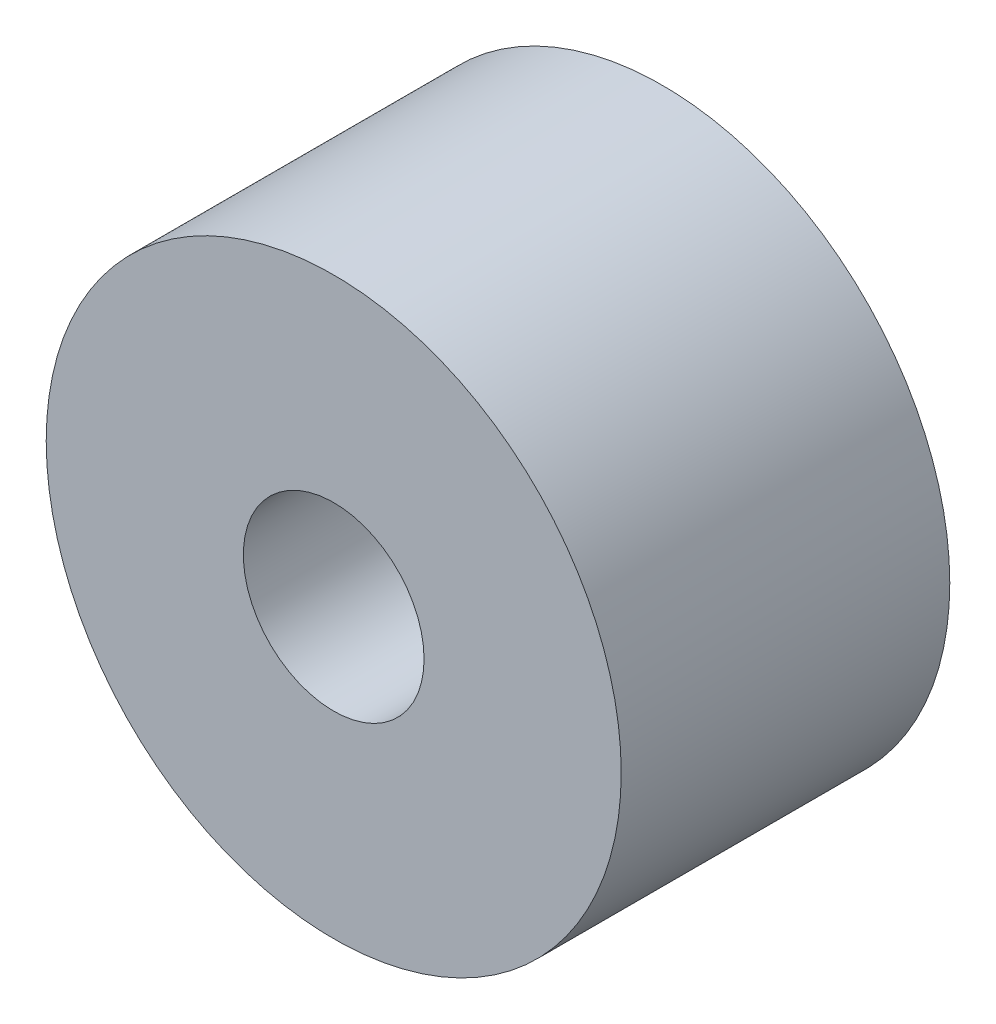
ISO-10303-21;
HEADER;
FILE_DESCRIPTION(('STEP AP214'),'2;1');
FILE_NAME('part.step','',(''),(''),'','','');
FILE_SCHEMA(('AUTOMOTIVE_DESIGN { 1 0 10303 214 1 1 1 1 }'));
ENDSEC;
DATA;
#1=APPLICATION_CONTEXT('core data for automotive mechanical design processes');
#2=APPLICATION_PROTOCOL_DEFINITION('international standard','automotive_design',2000,#1);
#3=PRODUCT_CONTEXT('',#1,'mechanical');
#4=PRODUCT('Part','Part','',(#3));
#5=PRODUCT_RELATED_PRODUCT_CATEGORY('part','',(#4));
#6=PRODUCT_DEFINITION_FORMATION('','',#4);
#7=PRODUCT_DEFINITION_CONTEXT('part definition',#1,'design');
#8=PRODUCT_DEFINITION('design','',#6,#7);
#9=PRODUCT_DEFINITION_SHAPE('','',#8);
#10=(LENGTH_UNIT() NAMED_UNIT(*) SI_UNIT(.MILLI.,.METRE.));
#11=(NAMED_UNIT(*) PLANE_ANGLE_UNIT() SI_UNIT($,.RADIAN.));
#12=(NAMED_UNIT(*) SI_UNIT($,.STERADIAN.) SOLID_ANGLE_UNIT());
#13=UNCERTAINTY_MEASURE_WITH_UNIT(LENGTH_MEASURE(1.E-05),#10,'distance_accuracy_value','');
#14=(GEOMETRIC_REPRESENTATION_CONTEXT(3) GLOBAL_UNCERTAINTY_ASSIGNED_CONTEXT((#13)) GLOBAL_UNIT_ASSIGNED_CONTEXT((#10,
#11,#12)) REPRESENTATION_CONTEXT('',''));
#15=CARTESIAN_POINT('',(0.,0.,0.));
#16=DIRECTION('',(0.,0.,1.));
#17=DIRECTION('',(1.,0.,0.));
#18=AXIS2_PLACEMENT_3D('',#15,#16,#17);
#19=CARTESIAN_POINT('',(0.,0.,5.));
#20=DIRECTION('',(0.,0.,1.));
#21=DIRECTION('',(1.,0.,0.));
#22=AXIS2_PLACEMENT_3D('',#19,#20,#21);
#23=PLANE('',#22);
#24=CARTESIAN_POINT('',(0.,0.,5.));
#25=DIRECTION('',(0.,0.,1.));
#26=DIRECTION('',(1.,0.,0.));
#27=AXIS2_PLACEMENT_3D('',#24,#25,#26);
#28=CIRCLE('',#27,4.375);
#29=CARTESIAN_POINT('',(4.375,0.,5.));
#30=VERTEX_POINT('',#29);
#31=EDGE_CURVE('E10',#30,#30,#28,.T.);
#32=ORIENTED_EDGE('',*,*,#31,.T.);
#33=EDGE_LOOP('',(#32));
#34=FACE_BOUND('',#33,.T.);
#35=CARTESIAN_POINT('',(0.,0.,5.));
#36=DIRECTION('',(0.,0.,1.));
#37=DIRECTION('',(1.,0.,0.));
#38=AXIS2_PLACEMENT_3D('',#35,#36,#37);
#39=CIRCLE('',#38,1.375);
#40=CARTESIAN_POINT('',(1.375,0.,5.));
#41=VERTEX_POINT('',#40);
#42=EDGE_CURVE('E42',#41,#41,#39,.T.);
#43=ORIENTED_EDGE('',*,*,#42,.F.);
#44=EDGE_LOOP('',(#43));
#45=FACE_BOUND('',#44,.T.);
#46=ADVANCED_FACE('F31',(#34,#45),#23,.T.);
#47=CARTESIAN_POINT('',(0.,0.,0.));
#48=DIRECTION('',(0.,0.,1.));
#49=DIRECTION('',(1.,0.,0.));
#50=AXIS2_PLACEMENT_3D('',#47,#48,#49);
#51=PLANE('',#50);
#52=CARTESIAN_POINT('',(0.,0.,0.));
#53=DIRECTION('',(0.,0.,1.));
#54=DIRECTION('',(1.,0.,0.));
#55=AXIS2_PLACEMENT_3D('',#52,#53,#54);
#56=CIRCLE('',#55,4.375);
#57=CARTESIAN_POINT('',(4.375,0.,0.));
#58=VERTEX_POINT('',#57);
#59=EDGE_CURVE('E35',#58,#58,#56,.T.);
#60=ORIENTED_EDGE('',*,*,#59,.F.);
#61=EDGE_LOOP('',(#60));
#62=FACE_BOUND('',#61,.T.);
#63=CARTESIAN_POINT('',(0.,0.,0.));
#64=DIRECTION('',(0.,0.,1.));
#65=DIRECTION('',(1.,0.,0.));
#66=AXIS2_PLACEMENT_3D('',#63,#64,#65);
#67=CIRCLE('',#66,1.375);
#68=CARTESIAN_POINT('',(1.375,0.,0.));
#69=VERTEX_POINT('',#68);
#70=EDGE_CURVE('E44',#69,#69,#67,.T.);
#71=ORIENTED_EDGE('',*,*,#70,.T.);
#72=EDGE_LOOP('',(#71));
#73=FACE_BOUND('',#72,.T.);
#74=ADVANCED_FACE('F54',(#62,#73),#51,.F.);
#75=CARTESIAN_POINT('',(0.,0.,5.));
#76=DIRECTION('',(0.,0.,-1.));
#77=DIRECTION('',(-1.,0.,0.));
#78=AXIS2_PLACEMENT_3D('',#75,#76,#77);
#79=CYLINDRICAL_SURFACE('',#78,4.375);
#80=ORIENTED_EDGE('',*,*,#31,.F.);
#81=EDGE_LOOP('',(#80));
#82=FACE_BOUND('',#81,.T.);
#83=ORIENTED_EDGE('',*,*,#59,.T.);
#84=EDGE_LOOP('',(#83));
#85=FACE_BOUND('',#84,.T.);
#86=ADVANCED_FACE('F33',(#82,#85),#79,.T.);
#87=CARTESIAN_POINT('',(0.,0.,5.));
#88=DIRECTION('',(0.,0.,-1.));
#89=DIRECTION('',(-1.,0.,0.));
#90=AXIS2_PLACEMENT_3D('',#87,#88,#89);
#91=CYLINDRICAL_SURFACE('',#90,1.375);
#92=ORIENTED_EDGE('',*,*,#42,.T.);
#93=EDGE_LOOP('',(#92));
#94=FACE_BOUND('',#93,.T.);
#95=ORIENTED_EDGE('',*,*,#70,.F.);
#96=EDGE_LOOP('',(#95));
#97=FACE_BOUND('',#96,.T.);
#98=ADVANCED_FACE('F50',(#94,#97),#91,.F.);
#99=CLOSED_SHELL('',(#46,#74,#86,#98));
#100=MANIFOLD_SOLID_BREP('B2',#99);
#101=ADVANCED_BREP_SHAPE_REPRESENTATION('',(#18,#100),#14);
#102=SHAPE_DEFINITION_REPRESENTATION(#9,#101);
ENDSEC;
END-ISO-10303-21;
